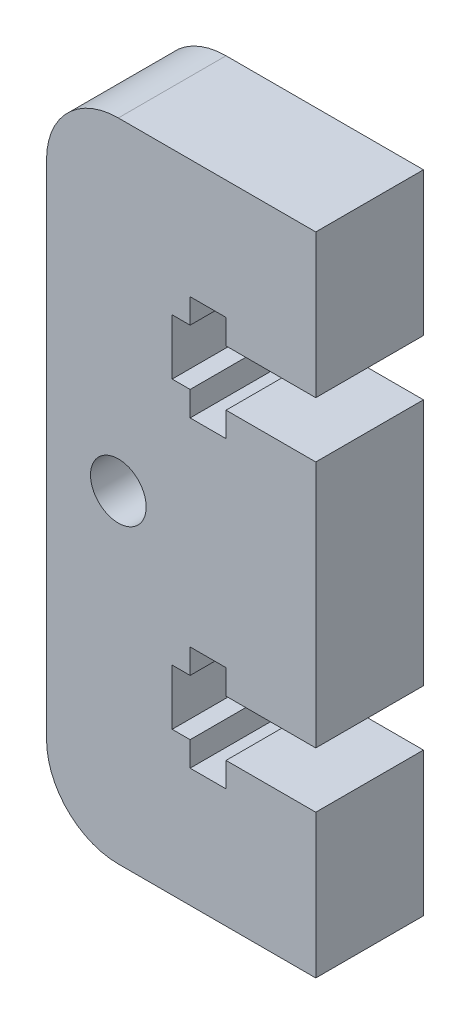
ISO-10303-21;
HEADER;
FILE_DESCRIPTION(('STEP AP214'),'2;1');
FILE_NAME('part.step','',(''),(''),'','','');
FILE_SCHEMA(('AUTOMOTIVE_DESIGN { 1 0 10303 214 1 1 1 1 }'));
ENDSEC;
DATA;
#1=APPLICATION_CONTEXT('core data for automotive mechanical design processes');
#2=APPLICATION_PROTOCOL_DEFINITION('international standard','automotive_design',2000,#1);
#3=PRODUCT_CONTEXT('',#1,'mechanical');
#4=PRODUCT('Part','Part','',(#3));
#5=PRODUCT_RELATED_PRODUCT_CATEGORY('part','',(#4));
#6=PRODUCT_DEFINITION_FORMATION('','',#4);
#7=PRODUCT_DEFINITION_CONTEXT('part definition',#1,'design');
#8=PRODUCT_DEFINITION('design','',#6,#7);
#9=PRODUCT_DEFINITION_SHAPE('','',#8);
#10=(LENGTH_UNIT() NAMED_UNIT(*) SI_UNIT(.MILLI.,.METRE.));
#11=(NAMED_UNIT(*) PLANE_ANGLE_UNIT() SI_UNIT($,.RADIAN.));
#12=(NAMED_UNIT(*) SI_UNIT($,.STERADIAN.) SOLID_ANGLE_UNIT());
#13=UNCERTAINTY_MEASURE_WITH_UNIT(LENGTH_MEASURE(1.E-05),#10,'distance_accuracy_value','');
#14=(GEOMETRIC_REPRESENTATION_CONTEXT(3) GLOBAL_UNCERTAINTY_ASSIGNED_CONTEXT((#13)) GLOBAL_UNIT_ASSIGNED_CONTEXT((#10,
#11,#12)) REPRESENTATION_CONTEXT('',''));
#15=CARTESIAN_POINT('',(0.,0.,0.));
#16=DIRECTION('',(0.,0.,1.));
#17=DIRECTION('',(1.,0.,0.));
#18=AXIS2_PLACEMENT_3D('',#15,#16,#17);
#19=CARTESIAN_POINT('',(1184.54189472516,236.727796113171,-5.99999999999998));
#20=DIRECTION('',(-1.,0.,0.));
#21=DIRECTION('',(0.,0.,1.));
#22=AXIS2_PLACEMENT_3D('',#19,#20,#21);
#23=PLANE('',#22);
#24=DIRECTION('',(0.,0.,-1.));
#25=VECTOR('',#24,1.);
#26=CARTESIAN_POINT('',(1184.54189472516,211.827796113171,9.00000000000016));
#27=LINE('',#26,#25);
#28=CARTESIAN_POINT('',(1184.54189472516,211.827796113171,0.));
#29=VERTEX_POINT('',#28);
#30=CARTESIAN_POINT('',(1184.54189472516,211.827796113171,-5.99999999999984));
#31=VERTEX_POINT('',#30);
#32=EDGE_CURVE('E286',#29,#31,#27,.T.);
#33=ORIENTED_EDGE('',*,*,#32,.T.);
#34=DIRECTION('',(0.,-1.,0.));
#35=VECTOR('',#34,1.);
#36=CARTESIAN_POINT('',(1184.54189472516,236.727796113171,-5.99999999999998));
#37=LINE('',#36,#35);
#38=CARTESIAN_POINT('',(1184.54189472516,225.627796113171,-5.99999999999984));
#39=VERTEX_POINT('',#38);
#40=EDGE_CURVE('E255',#39,#31,#37,.T.);
#41=ORIENTED_EDGE('',*,*,#40,.F.);
#42=DIRECTION('',(0.,0.,-1.));
#43=VECTOR('',#42,1.);
#44=CARTESIAN_POINT('',(1184.54189472516,225.627796113171,9.00000000000016));
#45=LINE('',#44,#43);
#46=CARTESIAN_POINT('',(1184.54189472516,225.627796113171,0.));
#47=VERTEX_POINT('',#46);
#48=EDGE_CURVE('E340',#47,#39,#45,.T.);
#49=ORIENTED_EDGE('',*,*,#48,.F.);
#50=DIRECTION('',(0.,-1.,0.));
#51=VECTOR('',#50,1.);
#52=CARTESIAN_POINT('',(1184.54189472516,236.727796113171,0.));
#53=LINE('',#52,#51);
#54=EDGE_CURVE('E391',#47,#29,#53,.T.);
#55=ORIENTED_EDGE('',*,*,#54,.T.);
#56=EDGE_LOOP('',(#33,#41,#49,#55));
#57=FACE_BOUND('',#56,.T.);
#58=ADVANCED_FACE('F34',(#57),#23,.F.);
#59=DIRECTION('',(0.,0.,-1.));
#60=VECTOR('',#59,1.);
#61=CARTESIAN_POINT('',(1184.54189472516,208.727796113171,9.00000000000016));
#62=LINE('',#61,#60);
#63=CARTESIAN_POINT('',(1184.54189472516,208.727796113171,0.));
#64=VERTEX_POINT('',#63);
#65=CARTESIAN_POINT('',(1184.54189472516,208.727796113171,-5.99999999999984));
#66=VERTEX_POINT('',#65);
#67=EDGE_CURVE('E288',#64,#66,#62,.T.);
#68=ORIENTED_EDGE('',*,*,#67,.F.);
#69=CARTESIAN_POINT('',(1184.54189472516,200.727796113171,0.));
#70=VERTEX_POINT('',#69);
#71=EDGE_CURVE('E387',#64,#70,#53,.T.);
#72=ORIENTED_EDGE('',*,*,#71,.T.);
#73=DIRECTION('',(0.,0.,1.));
#74=VECTOR('',#73,1.);
#75=CARTESIAN_POINT('',(1184.54189472516,200.727796113171,-5.99999999999998));
#76=LINE('',#75,#74);
#77=CARTESIAN_POINT('',(1184.54189472516,200.727796113171,-5.99999999999998));
#78=VERTEX_POINT('',#77);
#79=EDGE_CURVE('E395',#78,#70,#76,.T.);
#80=ORIENTED_EDGE('',*,*,#79,.F.);
#81=EDGE_CURVE('E372',#66,#78,#37,.T.);
#82=ORIENTED_EDGE('',*,*,#81,.F.);
#83=EDGE_LOOP('',(#68,#72,#80,#82));
#84=FACE_BOUND('',#83,.T.);
#85=ADVANCED_FACE('F496',(#84),#23,.F.);
#86=CARTESIAN_POINT('',(1173.54189472516,204.727796113171,-5.99999999999998));
#87=DIRECTION('',(0.,0.,-1.));
#88=DIRECTION('',(-1.,0.,0.));
#89=AXIS2_PLACEMENT_3D('',#86,#87,#88);
#90=PLANE('',#89);
#91=CARTESIAN_POINT('',(1173.54189472516,218.727796113171,-5.99999999999998));
#92=DIRECTION('',(0.,0.,-1.));
#93=DIRECTION('',(-1.,0.,0.));
#94=AXIS2_PLACEMENT_3D('',#91,#92,#93);
#95=CIRCLE('',#94,1.54999999999999);
#96=CARTESIAN_POINT('',(1171.99189472516,218.727796113171,-5.99999999999998));
#97=VERTEX_POINT('',#96);
#98=EDGE_CURVE('E258',#97,#97,#95,.T.);
#99=ORIENTED_EDGE('',*,*,#98,.F.);
#100=EDGE_LOOP('',(#99));
#101=FACE_BOUND('',#100,.T.);
#102=ORIENTED_EDGE('',*,*,#40,.T.);
#103=DIRECTION('',(-1.,0.,0.));
#104=VECTOR('',#103,1.);
#105=CARTESIAN_POINT('',(1184.54189472516,211.827796113171,-5.99999999999984));
#106=LINE('',#105,#104);
#107=CARTESIAN_POINT('',(1179.54189472516,211.827796113171,-5.99999999999984));
#108=VERTEX_POINT('',#107);
#109=EDGE_CURVE('E234',#31,#108,#106,.T.);
#110=ORIENTED_EDGE('',*,*,#109,.T.);
#111=DIRECTION('',(0.,1.,0.));
#112=VECTOR('',#111,1.);
#113=CARTESIAN_POINT('',(1179.54189472516,213.202796113171,-5.99999999999984));
#114=LINE('',#113,#112);
#115=CARTESIAN_POINT('',(1179.54189472516,213.202796113171,-5.99999999999984));
#116=VERTEX_POINT('',#115);
#117=EDGE_CURVE('E243',#108,#116,#114,.T.);
#118=ORIENTED_EDGE('',*,*,#117,.T.);
#119=DIRECTION('',(-1.,0.,0.));
#120=VECTOR('',#119,1.);
#121=CARTESIAN_POINT('',(1177.54189472516,213.202796113171,-5.99999999999984));
#122=LINE('',#121,#120);
#123=CARTESIAN_POINT('',(1177.54189472516,213.202796113171,-5.99999999999984));
#124=VERTEX_POINT('',#123);
#125=EDGE_CURVE('E249',#116,#124,#122,.T.);
#126=ORIENTED_EDGE('',*,*,#125,.T.);
#127=DIRECTION('',(0.,-1.,0.));
#128=VECTOR('',#127,1.);
#129=CARTESIAN_POINT('',(1177.54189472516,213.202796113171,-5.99999999999984));
#130=LINE('',#129,#128);
#131=CARTESIAN_POINT('',(1177.54189472516,211.827796113171,-5.99999999999984));
#132=VERTEX_POINT('',#131);
#133=EDGE_CURVE('E262',#124,#132,#130,.T.);
#134=ORIENTED_EDGE('',*,*,#133,.T.);
#135=DIRECTION('',(-1.,0.,0.));
#136=VECTOR('',#135,1.);
#137=CARTESIAN_POINT('',(1177.54189472516,211.827796113171,-5.99999999999984));
#138=LINE('',#137,#136);
#139=CARTESIAN_POINT('',(1176.54189472516,211.827796113171,-5.99999999999984));
#140=VERTEX_POINT('',#139);
#141=EDGE_CURVE('E265',#132,#140,#138,.T.);
#142=ORIENTED_EDGE('',*,*,#141,.T.);
#143=DIRECTION('',(0.,-1.,0.));
#144=VECTOR('',#143,1.);
#145=CARTESIAN_POINT('',(1176.54189472516,211.827796113171,-5.99999999999984));
#146=LINE('',#145,#144);
#147=CARTESIAN_POINT('',(1176.54189472516,208.727796113171,-5.99999999999984));
#148=VERTEX_POINT('',#147);
#149=EDGE_CURVE('E268',#140,#148,#146,.T.);
#150=ORIENTED_EDGE('',*,*,#149,.T.);
#151=DIRECTION('',(1.,0.,0.));
#152=VECTOR('',#151,1.);
#153=CARTESIAN_POINT('',(1177.54189472516,208.727796113171,-5.99999999999984));
#154=LINE('',#153,#152);
#155=CARTESIAN_POINT('',(1177.54189472516,208.727796113171,-5.99999999999984));
#156=VERTEX_POINT('',#155);
#157=EDGE_CURVE('E271',#148,#156,#154,.T.);
#158=ORIENTED_EDGE('',*,*,#157,.T.);
#159=DIRECTION('',(0.,-1.,0.));
#160=VECTOR('',#159,1.);
#161=CARTESIAN_POINT('',(1177.54189472516,208.727796113171,-5.99999999999984));
#162=LINE('',#161,#160);
#163=CARTESIAN_POINT('',(1177.54189472516,207.352796113171,-5.99999999999984));
#164=VERTEX_POINT('',#163);
#165=EDGE_CURVE('E274',#156,#164,#162,.T.);
#166=ORIENTED_EDGE('',*,*,#165,.T.);
#167=DIRECTION('',(1.,0.,0.));
#168=VECTOR('',#167,1.);
#169=CARTESIAN_POINT('',(1177.54189472516,207.352796113171,-5.99999999999984));
#170=LINE('',#169,#168);
#171=CARTESIAN_POINT('',(1179.54189472516,207.352796113171,-5.99999999999984));
#172=VERTEX_POINT('',#171);
#173=EDGE_CURVE('E277',#164,#172,#170,.T.);
#174=ORIENTED_EDGE('',*,*,#173,.T.);
#175=DIRECTION('',(0.,1.,0.));
#176=VECTOR('',#175,1.);
#177=CARTESIAN_POINT('',(1179.54189472516,208.727796113171,-5.99999999999984));
#178=LINE('',#177,#176);
#179=CARTESIAN_POINT('',(1179.54189472516,208.727796113171,-5.99999999999984));
#180=VERTEX_POINT('',#179);
#181=EDGE_CURVE('E280',#172,#180,#178,.T.);
#182=ORIENTED_EDGE('',*,*,#181,.T.);
#183=DIRECTION('',(1.,0.,0.));
#184=VECTOR('',#183,1.);
#185=CARTESIAN_POINT('',(1184.54189472516,208.727796113171,-5.99999999999984));
#186=LINE('',#185,#184);
#187=EDGE_CURVE('E283',#180,#66,#186,.T.);
#188=ORIENTED_EDGE('',*,*,#187,.T.);
#189=ORIENTED_EDGE('',*,*,#81,.T.);
#190=DIRECTION('',(-1.,0.,0.));
#191=VECTOR('',#190,1.);
#192=CARTESIAN_POINT('',(1184.54189472516,200.727796113171,-5.99999999999998));
#193=LINE('',#192,#191);
#194=CARTESIAN_POINT('',(1173.54189472516,200.727796113171,-5.99999999999998));
#195=VERTEX_POINT('',#194);
#196=EDGE_CURVE('E376',#78,#195,#193,.T.);
#197=ORIENTED_EDGE('',*,*,#196,.T.);
#198=CARTESIAN_POINT('',(1173.54189472516,204.727796113171,-5.99999999999998));
#199=DIRECTION('',(0.,0.,-1.));
#200=DIRECTION('',(-1.,0.,0.));
#201=AXIS2_PLACEMENT_3D('',#198,#199,#200);
#202=CIRCLE('',#201,4.);
#203=CARTESIAN_POINT('',(1169.54189472516,204.727796113171,-5.99999999999998));
#204=VERTEX_POINT('',#203);
#205=EDGE_CURVE('E362',#195,#204,#202,.T.);
#206=ORIENTED_EDGE('',*,*,#205,.T.);
#207=DIRECTION('',(0.,1.,0.));
#208=VECTOR('',#207,1.);
#209=CARTESIAN_POINT('',(1169.54189472516,232.727796113171,-5.99999999999998));
#210=LINE('',#209,#208);
#211=CARTESIAN_POINT('',(1169.54189472516,232.727796113171,-5.99999999999998));
#212=VERTEX_POINT('',#211);
#213=EDGE_CURVE('E365',#204,#212,#210,.T.);
#214=ORIENTED_EDGE('',*,*,#213,.T.);
#215=CARTESIAN_POINT('',(1173.54189472516,232.727796113171,-5.99999999999998));
#216=DIRECTION('',(0.,0.,-1.));
#217=DIRECTION('',(1.,0.,0.));
#218=AXIS2_PLACEMENT_3D('',#215,#216,#217);
#219=CIRCLE('',#218,4.);
#220=CARTESIAN_POINT('',(1173.54189472516,236.727796113171,-5.99999999999998));
#221=VERTEX_POINT('',#220);
#222=EDGE_CURVE('E368',#212,#221,#219,.T.);
#223=ORIENTED_EDGE('',*,*,#222,.T.);
#224=DIRECTION('',(1.,0.,0.));
#225=VECTOR('',#224,1.);
#226=CARTESIAN_POINT('',(1184.54189472516,236.727796113171,-5.99999999999998));
#227=LINE('',#226,#225);
#228=CARTESIAN_POINT('',(1184.54189472516,236.727796113171,-5.99999999999998));
#229=VERTEX_POINT('',#228);
#230=EDGE_CURVE('E370',#221,#229,#227,.T.);
#231=ORIENTED_EDGE('',*,*,#230,.T.);
#232=CARTESIAN_POINT('',(1184.54189472516,228.727796113171,-5.99999999999984));
#233=VERTEX_POINT('',#232);
#234=EDGE_CURVE('E373',#229,#233,#37,.T.);
#235=ORIENTED_EDGE('',*,*,#234,.T.);
#236=DIRECTION('',(-1.,0.,0.));
#237=VECTOR('',#236,1.);
#238=CARTESIAN_POINT('',(1184.54189472516,228.727796113171,-5.99999999999984));
#239=LINE('',#238,#237);
#240=CARTESIAN_POINT('',(1179.54189472516,228.727796113171,-5.99999999999984));
#241=VERTEX_POINT('',#240);
#242=EDGE_CURVE('E239',#233,#241,#239,.T.);
#243=ORIENTED_EDGE('',*,*,#242,.T.);
#244=DIRECTION('',(0.,1.,0.));
#245=VECTOR('',#244,1.);
#246=CARTESIAN_POINT('',(1179.54189472516,230.102796113171,-5.99999999999984));
#247=LINE('',#246,#245);
#248=CARTESIAN_POINT('',(1179.54189472516,230.102796113171,-5.99999999999984));
#249=VERTEX_POINT('',#248);
#250=EDGE_CURVE('E308',#241,#249,#247,.T.);
#251=ORIENTED_EDGE('',*,*,#250,.T.);
#252=DIRECTION('',(-1.,0.,0.));
#253=VECTOR('',#252,1.);
#254=CARTESIAN_POINT('',(1177.54189472516,230.102796113171,-5.99999999999984));
#255=LINE('',#254,#253);
#256=CARTESIAN_POINT('',(1177.54189472516,230.102796113171,-5.99999999999984));
#257=VERTEX_POINT('',#256);
#258=EDGE_CURVE('E311',#249,#257,#255,.T.);
#259=ORIENTED_EDGE('',*,*,#258,.T.);
#260=DIRECTION('',(0.,-1.,0.));
#261=VECTOR('',#260,1.);
#262=CARTESIAN_POINT('',(1177.54189472516,230.102796113171,-5.99999999999984));
#263=LINE('',#262,#261);
#264=CARTESIAN_POINT('',(1177.54189472516,228.727796113171,-5.99999999999984));
#265=VERTEX_POINT('',#264);
#266=EDGE_CURVE('E314',#257,#265,#263,.T.);
#267=ORIENTED_EDGE('',*,*,#266,.T.);
#268=DIRECTION('',(-1.,0.,0.));
#269=VECTOR('',#268,1.);
#270=CARTESIAN_POINT('',(1177.54189472516,228.727796113171,-5.99999999999984));
#271=LINE('',#270,#269);
#272=CARTESIAN_POINT('',(1176.54189472516,228.727796113171,-5.99999999999984));
#273=VERTEX_POINT('',#272);
#274=EDGE_CURVE('E317',#265,#273,#271,.T.);
#275=ORIENTED_EDGE('',*,*,#274,.T.);
#276=DIRECTION('',(0.,-1.,0.));
#277=VECTOR('',#276,1.);
#278=CARTESIAN_POINT('',(1176.54189472516,228.727796113171,-5.99999999999984));
#279=LINE('',#278,#277);
#280=CARTESIAN_POINT('',(1176.54189472516,225.627796113171,-5.99999999999984));
#281=VERTEX_POINT('',#280);
#282=EDGE_CURVE('E320',#273,#281,#279,.T.);
#283=ORIENTED_EDGE('',*,*,#282,.T.);
#284=DIRECTION('',(1.,0.,0.));
#285=VECTOR('',#284,1.);
#286=CARTESIAN_POINT('',(1177.54189472516,225.627796113171,-5.99999999999984));
#287=LINE('',#286,#285);
#288=CARTESIAN_POINT('',(1177.54189472516,225.627796113171,-5.99999999999984));
#289=VERTEX_POINT('',#288);
#290=EDGE_CURVE('E323',#281,#289,#287,.T.);
#291=ORIENTED_EDGE('',*,*,#290,.T.);
#292=DIRECTION('',(0.,-1.,0.));
#293=VECTOR('',#292,1.);
#294=CARTESIAN_POINT('',(1177.54189472516,225.627796113171,-5.99999999999984));
#295=LINE('',#294,#293);
#296=CARTESIAN_POINT('',(1177.54189472516,224.252796113171,-5.99999999999984));
#297=VERTEX_POINT('',#296);
#298=EDGE_CURVE('E326',#289,#297,#295,.T.);
#299=ORIENTED_EDGE('',*,*,#298,.T.);
#300=DIRECTION('',(1.,0.,0.));
#301=VECTOR('',#300,1.);
#302=CARTESIAN_POINT('',(1177.54189472516,224.252796113171,-5.99999999999984));
#303=LINE('',#302,#301);
#304=CARTESIAN_POINT('',(1179.54189472516,224.252796113171,-5.99999999999984));
#305=VERTEX_POINT('',#304);
#306=EDGE_CURVE('E329',#297,#305,#303,.T.);
#307=ORIENTED_EDGE('',*,*,#306,.T.);
#308=DIRECTION('',(0.,1.,0.));
#309=VECTOR('',#308,1.);
#310=CARTESIAN_POINT('',(1179.54189472516,225.627796113171,-5.99999999999984));
#311=LINE('',#310,#309);
#312=CARTESIAN_POINT('',(1179.54189472516,225.627796113171,-5.99999999999984));
#313=VERTEX_POINT('',#312);
#314=EDGE_CURVE('E332',#305,#313,#311,.T.);
#315=ORIENTED_EDGE('',*,*,#314,.T.);
#316=DIRECTION('',(1.,0.,0.));
#317=VECTOR('',#316,1.);
#318=CARTESIAN_POINT('',(1184.54189472516,225.627796113171,-5.99999999999984));
#319=LINE('',#318,#317);
#320=EDGE_CURVE('E335',#313,#39,#319,.T.);
#321=ORIENTED_EDGE('',*,*,#320,.T.);
#322=EDGE_LOOP('',(#102,#110,#118,#126,#134,#142,#150,#158,#166,#174,#182,#188,#189,#197,#206,
#214,#223,#231,#235,#243,#251,#259,#267,#275,#283,#291,#299,#307,#315,#321));
#323=FACE_BOUND('',#322,.T.);
#324=ADVANCED_FACE('F252',(#101,#323),#90,.T.);
#325=CARTESIAN_POINT('',(1173.54189472516,204.727796113171,0.));
#326=DIRECTION('',(0.,0.,-1.));
#327=DIRECTION('',(-1.,0.,0.));
#328=AXIS2_PLACEMENT_3D('',#325,#326,#327);
#329=PLANE('',#328);
#330=CARTESIAN_POINT('',(1173.54189472516,218.727796113171,0.));
#331=DIRECTION('',(0.,0.,-1.));
#332=DIRECTION('',(-1.,0.,0.));
#333=AXIS2_PLACEMENT_3D('',#330,#331,#332);
#334=CIRCLE('',#333,1.54999999999999);
#335=CARTESIAN_POINT('',(1171.99189472516,218.727796113171,0.));
#336=VERTEX_POINT('',#335);
#337=EDGE_CURVE('E38',#336,#336,#334,.T.);
#338=ORIENTED_EDGE('',*,*,#337,.T.);
#339=EDGE_LOOP('',(#338));
#340=FACE_BOUND('',#339,.T.);
#341=DIRECTION('',(-1.,0.,0.));
#342=VECTOR('',#341,1.);
#343=CARTESIAN_POINT('',(1173.54189472516,211.827796113171,0.));
#344=LINE('',#343,#342);
#345=CARTESIAN_POINT('',(1179.54189472516,211.827796113171,0.));
#346=VERTEX_POINT('',#345);
#347=EDGE_CURVE('E11',#29,#346,#344,.T.);
#348=ORIENTED_EDGE('',*,*,#347,.F.);
#349=ORIENTED_EDGE('',*,*,#54,.F.);
#350=DIRECTION('',(1.,0.,0.));
#351=VECTOR('',#350,1.);
#352=CARTESIAN_POINT('',(1173.54189472516,225.627796113171,0.));
#353=LINE('',#352,#351);
#354=CARTESIAN_POINT('',(1179.54189472516,225.627796113171,0.));
#355=VERTEX_POINT('',#354);
#356=EDGE_CURVE('E410',#355,#47,#353,.T.);
#357=ORIENTED_EDGE('',*,*,#356,.F.);
#358=DIRECTION('',(0.,1.,0.));
#359=VECTOR('',#358,1.);
#360=CARTESIAN_POINT('',(1179.54189472516,204.727796113171,0.));
#361=LINE('',#360,#359);
#362=CARTESIAN_POINT('',(1179.54189472516,224.252796113171,0.));
#363=VERTEX_POINT('',#362);
#364=EDGE_CURVE('E412',#363,#355,#361,.T.);
#365=ORIENTED_EDGE('',*,*,#364,.F.);
#366=DIRECTION('',(1.,0.,0.));
#367=VECTOR('',#366,1.);
#368=CARTESIAN_POINT('',(1173.54189472516,224.252796113171,0.));
#369=LINE('',#368,#367);
#370=CARTESIAN_POINT('',(1177.54189472516,224.252796113171,0.));
#371=VERTEX_POINT('',#370);
#372=EDGE_CURVE('E414',#371,#363,#369,.T.);
#373=ORIENTED_EDGE('',*,*,#372,.F.);
#374=DIRECTION('',(0.,-1.,0.));
#375=VECTOR('',#374,1.);
#376=CARTESIAN_POINT('',(1177.54189472516,204.727796113171,0.));
#377=LINE('',#376,#375);
#378=CARTESIAN_POINT('',(1177.54189472516,225.627796113171,0.));
#379=VERTEX_POINT('',#378);
#380=EDGE_CURVE('E416',#379,#371,#377,.T.);
#381=ORIENTED_EDGE('',*,*,#380,.F.);
#382=DIRECTION('',(1.,0.,0.));
#383=VECTOR('',#382,1.);
#384=CARTESIAN_POINT('',(1173.54189472516,225.627796113171,0.));
#385=LINE('',#384,#383);
#386=CARTESIAN_POINT('',(1176.54189472516,225.627796113171,0.));
#387=VERTEX_POINT('',#386);
#388=EDGE_CURVE('E418',#387,#379,#385,.T.);
#389=ORIENTED_EDGE('',*,*,#388,.F.);
#390=DIRECTION('',(0.,-1.,0.));
#391=VECTOR('',#390,1.);
#392=CARTESIAN_POINT('',(1176.54189472516,204.727796113171,0.));
#393=LINE('',#392,#391);
#394=CARTESIAN_POINT('',(1176.54189472516,228.727796113171,0.));
#395=VERTEX_POINT('',#394);
#396=EDGE_CURVE('E420',#395,#387,#393,.T.);
#397=ORIENTED_EDGE('',*,*,#396,.F.);
#398=DIRECTION('',(-1.,0.,0.));
#399=VECTOR('',#398,1.);
#400=CARTESIAN_POINT('',(1173.54189472516,228.727796113171,0.));
#401=LINE('',#400,#399);
#402=CARTESIAN_POINT('',(1177.54189472516,228.727796113171,0.));
#403=VERTEX_POINT('',#402);
#404=EDGE_CURVE('E422',#403,#395,#401,.T.);
#405=ORIENTED_EDGE('',*,*,#404,.F.);
#406=DIRECTION('',(0.,-1.,0.));
#407=VECTOR('',#406,1.);
#408=CARTESIAN_POINT('',(1177.54189472516,204.727796113171,0.));
#409=LINE('',#408,#407);
#410=CARTESIAN_POINT('',(1177.54189472516,230.102796113171,0.));
#411=VERTEX_POINT('',#410);
#412=EDGE_CURVE('E424',#411,#403,#409,.T.);
#413=ORIENTED_EDGE('',*,*,#412,.F.);
#414=DIRECTION('',(-1.,0.,0.));
#415=VECTOR('',#414,1.);
#416=CARTESIAN_POINT('',(1173.54189472516,230.102796113171,0.));
#417=LINE('',#416,#415);
#418=CARTESIAN_POINT('',(1179.54189472516,230.102796113171,0.));
#419=VERTEX_POINT('',#418);
#420=EDGE_CURVE('E426',#419,#411,#417,.T.);
#421=ORIENTED_EDGE('',*,*,#420,.F.);
#422=DIRECTION('',(0.,1.,0.));
#423=VECTOR('',#422,1.);
#424=CARTESIAN_POINT('',(1179.54189472516,204.727796113171,0.));
#425=LINE('',#424,#423);
#426=CARTESIAN_POINT('',(1179.54189472516,228.727796113171,0.));
#427=VERTEX_POINT('',#426);
#428=EDGE_CURVE('E428',#427,#419,#425,.T.);
#429=ORIENTED_EDGE('',*,*,#428,.F.);
#430=DIRECTION('',(-1.,0.,0.));
#431=VECTOR('',#430,1.);
#432=CARTESIAN_POINT('',(1173.54189472516,228.727796113171,0.));
#433=LINE('',#432,#431);
#434=CARTESIAN_POINT('',(1184.54189472516,228.727796113171,0.));
#435=VERTEX_POINT('',#434);
#436=EDGE_CURVE('E430',#435,#427,#433,.T.);
#437=ORIENTED_EDGE('',*,*,#436,.F.);
#438=CARTESIAN_POINT('',(1184.54189472516,236.727796113171,0.));
#439=VERTEX_POINT('',#438);
#440=EDGE_CURVE('E388',#439,#435,#53,.T.);
#441=ORIENTED_EDGE('',*,*,#440,.F.);
#442=DIRECTION('',(1.,0.,0.));
#443=VECTOR('',#442,1.);
#444=CARTESIAN_POINT('',(1184.54189472516,236.727796113171,0.));
#445=LINE('',#444,#443);
#446=CARTESIAN_POINT('',(1173.54189472516,236.727796113171,0.));
#447=VERTEX_POINT('',#446);
#448=EDGE_CURVE('E385',#447,#439,#445,.T.);
#449=ORIENTED_EDGE('',*,*,#448,.F.);
#450=CARTESIAN_POINT('',(1173.54189472516,232.727796113171,0.));
#451=DIRECTION('',(0.,0.,-1.));
#452=DIRECTION('',(1.,0.,0.));
#453=AXIS2_PLACEMENT_3D('',#450,#451,#452);
#454=CIRCLE('',#453,4.);
#455=CARTESIAN_POINT('',(1169.54189472516,232.727796113171,0.));
#456=VERTEX_POINT('',#455);
#457=EDGE_CURVE('E383',#456,#447,#454,.T.);
#458=ORIENTED_EDGE('',*,*,#457,.F.);
#459=DIRECTION('',(0.,1.,0.));
#460=VECTOR('',#459,1.);
#461=CARTESIAN_POINT('',(1169.54189472516,232.727796113171,0.));
#462=LINE('',#461,#460);
#463=CARTESIAN_POINT('',(1169.54189472516,204.727796113171,0.));
#464=VERTEX_POINT('',#463);
#465=EDGE_CURVE('E381',#464,#456,#462,.T.);
#466=ORIENTED_EDGE('',*,*,#465,.F.);
#467=CARTESIAN_POINT('',(1173.54189472516,204.727796113171,0.));
#468=DIRECTION('',(0.,0.,-1.));
#469=DIRECTION('',(-1.,0.,0.));
#470=AXIS2_PLACEMENT_3D('',#467,#468,#469);
#471=CIRCLE('',#470,4.);
#472=CARTESIAN_POINT('',(1173.54189472516,200.727796113171,0.));
#473=VERTEX_POINT('',#472);
#474=EDGE_CURVE('E361',#473,#464,#471,.T.);
#475=ORIENTED_EDGE('',*,*,#474,.F.);
#476=DIRECTION('',(-1.,0.,0.));
#477=VECTOR('',#476,1.);
#478=CARTESIAN_POINT('',(1184.54189472516,200.727796113171,0.));
#479=LINE('',#478,#477);
#480=EDGE_CURVE('E366',#70,#473,#479,.T.);
#481=ORIENTED_EDGE('',*,*,#480,.F.);
#482=ORIENTED_EDGE('',*,*,#71,.F.);
#483=DIRECTION('',(1.,0.,0.));
#484=VECTOR('',#483,1.);
#485=CARTESIAN_POINT('',(1173.54189472516,208.727796113171,0.));
#486=LINE('',#485,#484);
#487=CARTESIAN_POINT('',(1179.54189472516,208.727796113171,0.));
#488=VERTEX_POINT('',#487);
#489=EDGE_CURVE('E432',#488,#64,#486,.T.);
#490=ORIENTED_EDGE('',*,*,#489,.F.);
#491=DIRECTION('',(0.,1.,0.));
#492=VECTOR('',#491,1.);
#493=CARTESIAN_POINT('',(1179.54189472516,204.727796113171,0.));
#494=LINE('',#493,#492);
#495=CARTESIAN_POINT('',(1179.54189472516,207.352796113171,0.));
#496=VERTEX_POINT('',#495);
#497=EDGE_CURVE('E434',#496,#488,#494,.T.);
#498=ORIENTED_EDGE('',*,*,#497,.F.);
#499=DIRECTION('',(1.,0.,0.));
#500=VECTOR('',#499,1.);
#501=CARTESIAN_POINT('',(1173.54189472516,207.352796113171,0.));
#502=LINE('',#501,#500);
#503=CARTESIAN_POINT('',(1177.54189472516,207.352796113171,0.));
#504=VERTEX_POINT('',#503);
#505=EDGE_CURVE('E436',#504,#496,#502,.T.);
#506=ORIENTED_EDGE('',*,*,#505,.F.);
#507=DIRECTION('',(0.,-1.,0.));
#508=VECTOR('',#507,1.);
#509=CARTESIAN_POINT('',(1177.54189472516,204.727796113171,0.));
#510=LINE('',#509,#508);
#511=CARTESIAN_POINT('',(1177.54189472516,208.727796113171,0.));
#512=VERTEX_POINT('',#511);
#513=EDGE_CURVE('E438',#512,#504,#510,.T.);
#514=ORIENTED_EDGE('',*,*,#513,.F.);
#515=DIRECTION('',(1.,0.,0.));
#516=VECTOR('',#515,1.);
#517=CARTESIAN_POINT('',(1173.54189472516,208.727796113171,0.));
#518=LINE('',#517,#516);
#519=CARTESIAN_POINT('',(1176.54189472516,208.727796113171,0.));
#520=VERTEX_POINT('',#519);
#521=EDGE_CURVE('E440',#520,#512,#518,.T.);
#522=ORIENTED_EDGE('',*,*,#521,.F.);
#523=DIRECTION('',(0.,-1.,0.));
#524=VECTOR('',#523,1.);
#525=CARTESIAN_POINT('',(1176.54189472516,204.727796113171,0.));
#526=LINE('',#525,#524);
#527=CARTESIAN_POINT('',(1176.54189472516,211.827796113171,0.));
#528=VERTEX_POINT('',#527);
#529=EDGE_CURVE('E442',#528,#520,#526,.T.);
#530=ORIENTED_EDGE('',*,*,#529,.F.);
#531=DIRECTION('',(-1.,0.,0.));
#532=VECTOR('',#531,1.);
#533=CARTESIAN_POINT('',(1173.54189472516,211.827796113171,0.));
#534=LINE('',#533,#532);
#535=CARTESIAN_POINT('',(1177.54189472516,211.827796113171,0.));
#536=VERTEX_POINT('',#535);
#537=EDGE_CURVE('E444',#536,#528,#534,.T.);
#538=ORIENTED_EDGE('',*,*,#537,.F.);
#539=DIRECTION('',(0.,-1.,0.));
#540=VECTOR('',#539,1.);
#541=CARTESIAN_POINT('',(1177.54189472516,204.727796113171,0.));
#542=LINE('',#541,#540);
#543=CARTESIAN_POINT('',(1177.54189472516,213.202796113171,0.));
#544=VERTEX_POINT('',#543);
#545=EDGE_CURVE('E446',#544,#536,#542,.T.);
#546=ORIENTED_EDGE('',*,*,#545,.F.);
#547=DIRECTION('',(-1.,0.,0.));
#548=VECTOR('',#547,1.);
#549=CARTESIAN_POINT('',(1173.54189472516,213.202796113171,0.));
#550=LINE('',#549,#548);
#551=CARTESIAN_POINT('',(1179.54189472516,213.202796113171,0.));
#552=VERTEX_POINT('',#551);
#553=EDGE_CURVE('E448',#552,#544,#550,.T.);
#554=ORIENTED_EDGE('',*,*,#553,.F.);
#555=DIRECTION('',(0.,1.,0.));
#556=VECTOR('',#555,1.);
#557=CARTESIAN_POINT('',(1179.54189472516,204.727796113171,0.));
#558=LINE('',#557,#556);
#559=EDGE_CURVE('E43',#346,#552,#558,.T.);
#560=ORIENTED_EDGE('',*,*,#559,.F.);
#561=EDGE_LOOP('',(#348,#349,#357,#365,#373,#381,#389,#397,#405,#413,#421,#429,#437,#441,#449,
#458,#466,#475,#481,#482,#490,#498,#506,#514,#522,#530,#538,#546,#554,#560));
#562=FACE_BOUND('',#561,.T.);
#563=ADVANCED_FACE('F456',(#340,#562),#329,.F.);
#564=DIRECTION('',(0.,0.,-1.));
#565=VECTOR('',#564,1.);
#566=CARTESIAN_POINT('',(1184.54189472516,228.727796113171,9.00000000000016));
#567=LINE('',#566,#565);
#568=EDGE_CURVE('E337',#435,#233,#567,.T.);
#569=ORIENTED_EDGE('',*,*,#568,.T.);
#570=ORIENTED_EDGE('',*,*,#234,.F.);
#571=DIRECTION('',(0.,0.,1.));
#572=VECTOR('',#571,1.);
#573=CARTESIAN_POINT('',(1184.54189472516,236.727796113171,-5.99999999999998));
#574=LINE('',#573,#572);
#575=EDGE_CURVE('E398',#229,#439,#574,.T.);
#576=ORIENTED_EDGE('',*,*,#575,.T.);
#577=ORIENTED_EDGE('',*,*,#440,.T.);
#578=EDGE_LOOP('',(#569,#570,#576,#577));
#579=FACE_BOUND('',#578,.T.);
#580=ADVANCED_FACE('F523',(#579),#23,.F.);
#581=CARTESIAN_POINT('',(1173.54189472516,204.727796113171,-5.99999999999998));
#582=DIRECTION('',(0.,0.,1.));
#583=DIRECTION('',(1.,0.,0.));
#584=AXIS2_PLACEMENT_3D('',#581,#582,#583);
#585=CYLINDRICAL_SURFACE('',#584,4.);
#586=ORIENTED_EDGE('',*,*,#474,.T.);
#587=DIRECTION('',(0.,0.,1.));
#588=VECTOR('',#587,1.);
#589=CARTESIAN_POINT('',(1169.54189472516,204.727796113171,-5.99999999999998));
#590=LINE('',#589,#588);
#591=EDGE_CURVE('E407',#204,#464,#590,.T.);
#592=ORIENTED_EDGE('',*,*,#591,.F.);
#593=ORIENTED_EDGE('',*,*,#205,.F.);
#594=DIRECTION('',(0.,0.,1.));
#595=VECTOR('',#594,1.);
#596=CARTESIAN_POINT('',(1173.54189472516,200.727796113171,-5.99999999999998));
#597=LINE('',#596,#595);
#598=EDGE_CURVE('E378',#195,#473,#597,.T.);
#599=ORIENTED_EDGE('',*,*,#598,.T.);
#600=EDGE_LOOP('',(#586,#592,#593,#599));
#601=FACE_BOUND('',#600,.T.);
#602=ADVANCED_FACE('F36',(#601),#585,.T.);
#603=CARTESIAN_POINT('',(1169.54189472516,232.727796113171,-5.99999999999998));
#604=DIRECTION('',(1.,0.,0.));
#605=DIRECTION('',(0.,0.,-1.));
#606=AXIS2_PLACEMENT_3D('',#603,#604,#605);
#607=PLANE('',#606);
#608=ORIENTED_EDGE('',*,*,#465,.T.);
#609=DIRECTION('',(0.,0.,1.));
#610=VECTOR('',#609,1.);
#611=CARTESIAN_POINT('',(1169.54189472516,232.727796113171,-5.99999999999998));
#612=LINE('',#611,#610);
#613=EDGE_CURVE('E404',#212,#456,#612,.T.);
#614=ORIENTED_EDGE('',*,*,#613,.F.);
#615=ORIENTED_EDGE('',*,*,#213,.F.);
#616=ORIENTED_EDGE('',*,*,#591,.T.);
#617=EDGE_LOOP('',(#608,#614,#615,#616));
#618=FACE_BOUND('',#617,.T.);
#619=ADVANCED_FACE('F509',(#618),#607,.F.);
#620=CARTESIAN_POINT('',(1173.54189472516,232.727796113171,-5.99999999999998));
#621=DIRECTION('',(0.,0.,1.));
#622=DIRECTION('',(1.,0.,0.));
#623=AXIS2_PLACEMENT_3D('',#620,#621,#622);
#624=CYLINDRICAL_SURFACE('',#623,4.);
#625=ORIENTED_EDGE('',*,*,#457,.T.);
#626=DIRECTION('',(0.,0.,1.));
#627=VECTOR('',#626,1.);
#628=CARTESIAN_POINT('',(1173.54189472516,236.727796113171,-5.99999999999998));
#629=LINE('',#628,#627);
#630=EDGE_CURVE('E401',#221,#447,#629,.T.);
#631=ORIENTED_EDGE('',*,*,#630,.F.);
#632=ORIENTED_EDGE('',*,*,#222,.F.);
#633=ORIENTED_EDGE('',*,*,#613,.T.);
#634=EDGE_LOOP('',(#625,#631,#632,#633));
#635=FACE_BOUND('',#634,.T.);
#636=ADVANCED_FACE('F514',(#635),#624,.T.);
#637=CARTESIAN_POINT('',(1184.54189472516,236.727796113171,-5.99999999999998));
#638=DIRECTION('',(0.,-1.,0.));
#639=DIRECTION('',(0.,0.,-1.));
#640=AXIS2_PLACEMENT_3D('',#637,#638,#639);
#641=PLANE('',#640);
#642=ORIENTED_EDGE('',*,*,#448,.T.);
#643=ORIENTED_EDGE('',*,*,#575,.F.);
#644=ORIENTED_EDGE('',*,*,#230,.F.);
#645=ORIENTED_EDGE('',*,*,#630,.T.);
#646=EDGE_LOOP('',(#642,#643,#644,#645));
#647=FACE_BOUND('',#646,.T.);
#648=ADVANCED_FACE('F519',(#647),#641,.F.);
#649=CARTESIAN_POINT('',(1184.54189472516,200.727796113171,-5.99999999999998));
#650=DIRECTION('',(0.,1.,0.));
#651=DIRECTION('',(0.,0.,1.));
#652=AXIS2_PLACEMENT_3D('',#649,#650,#651);
#653=PLANE('',#652);
#654=ORIENTED_EDGE('',*,*,#480,.T.);
#655=ORIENTED_EDGE('',*,*,#598,.F.);
#656=ORIENTED_EDGE('',*,*,#196,.F.);
#657=ORIENTED_EDGE('',*,*,#79,.T.);
#658=EDGE_LOOP('',(#654,#655,#656,#657));
#659=FACE_BOUND('',#658,.T.);
#660=ADVANCED_FACE('F502',(#659),#653,.F.);
#661=CARTESIAN_POINT('',(1184.54189472516,228.727796113171,9.00000000000016));
#662=DIRECTION('',(0.,-1.,0.));
#663=DIRECTION('',(0.,0.,-1.));
#664=AXIS2_PLACEMENT_3D('',#661,#662,#663);
#665=PLANE('',#664);
#666=ORIENTED_EDGE('',*,*,#436,.T.);
#667=DIRECTION('',(0.,0.,-1.));
#668=VECTOR('',#667,1.);
#669=CARTESIAN_POINT('',(1179.54189472516,228.727796113171,9.00000000000016));
#670=LINE('',#669,#668);
#671=EDGE_CURVE('E359',#427,#241,#670,.T.);
#672=ORIENTED_EDGE('',*,*,#671,.T.);
#673=ORIENTED_EDGE('',*,*,#242,.F.);
#674=ORIENTED_EDGE('',*,*,#568,.F.);
#675=EDGE_LOOP('',(#666,#672,#673,#674));
#676=FACE_BOUND('',#675,.T.);
#677=ADVANCED_FACE('F526',(#676),#665,.T.);
#678=CARTESIAN_POINT('',(1179.54189472516,230.102796113171,9.00000000000016));
#679=DIRECTION('',(-1.,0.,0.));
#680=DIRECTION('',(0.,0.,1.));
#681=AXIS2_PLACEMENT_3D('',#678,#679,#680);
#682=PLANE('',#681);
#683=ORIENTED_EDGE('',*,*,#428,.T.);
#684=DIRECTION('',(0.,0.,-1.));
#685=VECTOR('',#684,1.);
#686=CARTESIAN_POINT('',(1179.54189472516,230.102796113171,9.00000000000016));
#687=LINE('',#686,#685);
#688=EDGE_CURVE('E357',#419,#249,#687,.T.);
#689=ORIENTED_EDGE('',*,*,#688,.T.);
#690=ORIENTED_EDGE('',*,*,#250,.F.);
#691=ORIENTED_EDGE('',*,*,#671,.F.);
#692=EDGE_LOOP('',(#683,#689,#690,#691));
#693=FACE_BOUND('',#692,.T.);
#694=ADVANCED_FACE('F533',(#693),#682,.T.);
#695=CARTESIAN_POINT('',(1177.54189472516,230.102796113171,9.00000000000016));
#696=DIRECTION('',(0.,-1.,0.));
#697=DIRECTION('',(0.,0.,-1.));
#698=AXIS2_PLACEMENT_3D('',#695,#696,#697);
#699=PLANE('',#698);
#700=ORIENTED_EDGE('',*,*,#420,.T.);
#701=DIRECTION('',(0.,0.,-1.));
#702=VECTOR('',#701,1.);
#703=CARTESIAN_POINT('',(1177.54189472516,230.102796113171,9.00000000000016));
#704=LINE('',#703,#702);
#705=EDGE_CURVE('E355',#411,#257,#704,.T.);
#706=ORIENTED_EDGE('',*,*,#705,.T.);
#707=ORIENTED_EDGE('',*,*,#258,.F.);
#708=ORIENTED_EDGE('',*,*,#688,.F.);
#709=EDGE_LOOP('',(#700,#706,#707,#708));
#710=FACE_BOUND('',#709,.T.);
#711=ADVANCED_FACE('F537',(#710),#699,.T.);
#712=CARTESIAN_POINT('',(1177.54189472516,230.102796113171,9.00000000000016));
#713=DIRECTION('',(1.,0.,0.));
#714=DIRECTION('',(0.,0.,-1.));
#715=AXIS2_PLACEMENT_3D('',#712,#713,#714);
#716=PLANE('',#715);
#717=ORIENTED_EDGE('',*,*,#412,.T.);
#718=DIRECTION('',(0.,0.,-1.));
#719=VECTOR('',#718,1.);
#720=CARTESIAN_POINT('',(1177.54189472516,228.727796113171,9.00000000000016));
#721=LINE('',#720,#719);
#722=EDGE_CURVE('E353',#403,#265,#721,.T.);
#723=ORIENTED_EDGE('',*,*,#722,.T.);
#724=ORIENTED_EDGE('',*,*,#266,.F.);
#725=ORIENTED_EDGE('',*,*,#705,.F.);
#726=EDGE_LOOP('',(#717,#723,#724,#725));
#727=FACE_BOUND('',#726,.T.);
#728=ADVANCED_FACE('F542',(#727),#716,.T.);
#729=CARTESIAN_POINT('',(1177.54189472516,228.727796113171,9.00000000000016));
#730=DIRECTION('',(0.,-1.,0.));
#731=DIRECTION('',(0.,0.,-1.));
#732=AXIS2_PLACEMENT_3D('',#729,#730,#731);
#733=PLANE('',#732);
#734=ORIENTED_EDGE('',*,*,#404,.T.);
#735=DIRECTION('',(0.,0.,-1.));
#736=VECTOR('',#735,1.);
#737=CARTESIAN_POINT('',(1176.54189472516,228.727796113171,9.00000000000016));
#738=LINE('',#737,#736);
#739=EDGE_CURVE('E351',#395,#273,#738,.T.);
#740=ORIENTED_EDGE('',*,*,#739,.T.);
#741=ORIENTED_EDGE('',*,*,#274,.F.);
#742=ORIENTED_EDGE('',*,*,#722,.F.);
#743=EDGE_LOOP('',(#734,#740,#741,#742));
#744=FACE_BOUND('',#743,.T.);
#745=ADVANCED_FACE('F546',(#744),#733,.T.);
#746=CARTESIAN_POINT('',(1176.54189472516,228.727796113171,9.00000000000016));
#747=DIRECTION('',(1.,0.,0.));
#748=DIRECTION('',(0.,0.,-1.));
#749=AXIS2_PLACEMENT_3D('',#746,#747,#748);
#750=PLANE('',#749);
#751=ORIENTED_EDGE('',*,*,#396,.T.);
#752=DIRECTION('',(0.,0.,-1.));
#753=VECTOR('',#752,1.);
#754=CARTESIAN_POINT('',(1176.54189472516,225.627796113171,9.00000000000016));
#755=LINE('',#754,#753);
#756=EDGE_CURVE('E349',#387,#281,#755,.T.);
#757=ORIENTED_EDGE('',*,*,#756,.T.);
#758=ORIENTED_EDGE('',*,*,#282,.F.);
#759=ORIENTED_EDGE('',*,*,#739,.F.);
#760=EDGE_LOOP('',(#751,#757,#758,#759));
#761=FACE_BOUND('',#760,.T.);
#762=ADVANCED_FACE('F551',(#761),#750,.T.);
#763=CARTESIAN_POINT('',(1177.54189472516,225.627796113171,9.00000000000016));
#764=DIRECTION('',(0.,1.,0.));
#765=DIRECTION('',(0.,0.,1.));
#766=AXIS2_PLACEMENT_3D('',#763,#764,#765);
#767=PLANE('',#766);
#768=ORIENTED_EDGE('',*,*,#388,.T.);
#769=DIRECTION('',(0.,0.,-1.));
#770=VECTOR('',#769,1.);
#771=CARTESIAN_POINT('',(1177.54189472516,225.627796113171,9.00000000000016));
#772=LINE('',#771,#770);
#773=EDGE_CURVE('E347',#379,#289,#772,.T.);
#774=ORIENTED_EDGE('',*,*,#773,.T.);
#775=ORIENTED_EDGE('',*,*,#290,.F.);
#776=ORIENTED_EDGE('',*,*,#756,.F.);
#777=EDGE_LOOP('',(#768,#774,#775,#776));
#778=FACE_BOUND('',#777,.T.);
#779=ADVANCED_FACE('F556',(#778),#767,.T.);
#780=CARTESIAN_POINT('',(1177.54189472516,225.627796113171,9.00000000000016));
#781=DIRECTION('',(1.,0.,0.));
#782=DIRECTION('',(0.,0.,-1.));
#783=AXIS2_PLACEMENT_3D('',#780,#781,#782);
#784=PLANE('',#783);
#785=ORIENTED_EDGE('',*,*,#380,.T.);
#786=DIRECTION('',(0.,0.,-1.));
#787=VECTOR('',#786,1.);
#788=CARTESIAN_POINT('',(1177.54189472516,224.252796113171,9.00000000000016));
#789=LINE('',#788,#787);
#790=EDGE_CURVE('E345',#371,#297,#789,.T.);
#791=ORIENTED_EDGE('',*,*,#790,.T.);
#792=ORIENTED_EDGE('',*,*,#298,.F.);
#793=ORIENTED_EDGE('',*,*,#773,.F.);
#794=EDGE_LOOP('',(#785,#791,#792,#793));
#795=FACE_BOUND('',#794,.T.);
#796=ADVANCED_FACE('F561',(#795),#784,.T.);
#797=CARTESIAN_POINT('',(1177.54189472516,224.252796113171,9.00000000000016));
#798=DIRECTION('',(0.,1.,0.));
#799=DIRECTION('',(0.,0.,1.));
#800=AXIS2_PLACEMENT_3D('',#797,#798,#799);
#801=PLANE('',#800);
#802=ORIENTED_EDGE('',*,*,#372,.T.);
#803=DIRECTION('',(0.,0.,-1.));
#804=VECTOR('',#803,1.);
#805=CARTESIAN_POINT('',(1179.54189472516,224.252796113171,9.00000000000016));
#806=LINE('',#805,#804);
#807=EDGE_CURVE('E343',#363,#305,#806,.T.);
#808=ORIENTED_EDGE('',*,*,#807,.T.);
#809=ORIENTED_EDGE('',*,*,#306,.F.);
#810=ORIENTED_EDGE('',*,*,#790,.F.);
#811=EDGE_LOOP('',(#802,#808,#809,#810));
#812=FACE_BOUND('',#811,.T.);
#813=ADVANCED_FACE('F566',(#812),#801,.T.);
#814=CARTESIAN_POINT('',(1179.54189472516,225.627796113171,9.00000000000016));
#815=DIRECTION('',(-1.,0.,0.));
#816=DIRECTION('',(0.,0.,1.));
#817=AXIS2_PLACEMENT_3D('',#814,#815,#816);
#818=PLANE('',#817);
#819=ORIENTED_EDGE('',*,*,#364,.T.);
#820=DIRECTION('',(0.,0.,-1.));
#821=VECTOR('',#820,1.);
#822=CARTESIAN_POINT('',(1179.54189472516,225.627796113171,9.00000000000016));
#823=LINE('',#822,#821);
#824=EDGE_CURVE('E58',#355,#313,#823,.T.);
#825=ORIENTED_EDGE('',*,*,#824,.T.);
#826=ORIENTED_EDGE('',*,*,#314,.F.);
#827=ORIENTED_EDGE('',*,*,#807,.F.);
#828=EDGE_LOOP('',(#819,#825,#826,#827));
#829=FACE_BOUND('',#828,.T.);
#830=ADVANCED_FACE('F570',(#829),#818,.T.);
#831=CARTESIAN_POINT('',(1184.54189472516,225.627796113171,9.00000000000016));
#832=DIRECTION('',(0.,1.,0.));
#833=DIRECTION('',(0.,0.,1.));
#834=AXIS2_PLACEMENT_3D('',#831,#832,#833);
#835=PLANE('',#834);
#836=ORIENTED_EDGE('',*,*,#356,.T.);
#837=ORIENTED_EDGE('',*,*,#48,.T.);
#838=ORIENTED_EDGE('',*,*,#320,.F.);
#839=ORIENTED_EDGE('',*,*,#824,.F.);
#840=EDGE_LOOP('',(#836,#837,#838,#839));
#841=FACE_BOUND('',#840,.T.);
#842=ADVANCED_FACE('F573',(#841),#835,.T.);
#843=CARTESIAN_POINT('',(1184.54189472516,211.827796113171,9.00000000000016));
#844=DIRECTION('',(0.,-1.,0.));
#845=DIRECTION('',(0.,0.,-1.));
#846=AXIS2_PLACEMENT_3D('',#843,#844,#845);
#847=PLANE('',#846);
#848=ORIENTED_EDGE('',*,*,#347,.T.);
#849=DIRECTION('',(0.,0.,-1.));
#850=VECTOR('',#849,1.);
#851=CARTESIAN_POINT('',(1179.54189472516,211.827796113171,9.00000000000016));
#852=LINE('',#851,#850);
#853=EDGE_CURVE('E230',#346,#108,#852,.T.);
#854=ORIENTED_EDGE('',*,*,#853,.T.);
#855=ORIENTED_EDGE('',*,*,#109,.F.);
#856=ORIENTED_EDGE('',*,*,#32,.F.);
#857=EDGE_LOOP('',(#848,#854,#855,#856));
#858=FACE_BOUND('',#857,.T.);
#859=ADVANCED_FACE('F232',(#858),#847,.T.);
#860=CARTESIAN_POINT('',(1179.54189472516,213.202796113171,9.00000000000016));
#861=DIRECTION('',(-1.,0.,0.));
#862=DIRECTION('',(0.,0.,1.));
#863=AXIS2_PLACEMENT_3D('',#860,#861,#862);
#864=PLANE('',#863);
#865=ORIENTED_EDGE('',*,*,#559,.T.);
#866=DIRECTION('',(0.,0.,-1.));
#867=VECTOR('',#866,1.);
#868=CARTESIAN_POINT('',(1179.54189472516,213.202796113171,9.00000000000016));
#869=LINE('',#868,#867);
#870=EDGE_CURVE('E240',#552,#116,#869,.T.);
#871=ORIENTED_EDGE('',*,*,#870,.T.);
#872=ORIENTED_EDGE('',*,*,#117,.F.);
#873=ORIENTED_EDGE('',*,*,#853,.F.);
#874=EDGE_LOOP('',(#865,#871,#872,#873));
#875=FACE_BOUND('',#874,.T.);
#876=ADVANCED_FACE('F244',(#875),#864,.T.);
#877=CARTESIAN_POINT('',(1177.54189472516,213.202796113171,9.00000000000016));
#878=DIRECTION('',(0.,-1.,0.));
#879=DIRECTION('',(0.,0.,-1.));
#880=AXIS2_PLACEMENT_3D('',#877,#878,#879);
#881=PLANE('',#880);
#882=ORIENTED_EDGE('',*,*,#553,.T.);
#883=DIRECTION('',(0.,0.,-1.));
#884=VECTOR('',#883,1.);
#885=CARTESIAN_POINT('',(1177.54189472516,213.202796113171,9.00000000000016));
#886=LINE('',#885,#884);
#887=EDGE_CURVE('E303',#544,#124,#886,.T.);
#888=ORIENTED_EDGE('',*,*,#887,.T.);
#889=ORIENTED_EDGE('',*,*,#125,.F.);
#890=ORIENTED_EDGE('',*,*,#870,.F.);
#891=EDGE_LOOP('',(#882,#888,#889,#890));
#892=FACE_BOUND('',#891,.T.);
#893=ADVANCED_FACE('F453',(#892),#881,.T.);
#894=CARTESIAN_POINT('',(1177.54189472516,213.202796113171,9.00000000000016));
#895=DIRECTION('',(1.,0.,0.));
#896=DIRECTION('',(0.,0.,-1.));
#897=AXIS2_PLACEMENT_3D('',#894,#895,#896);
#898=PLANE('',#897);
#899=ORIENTED_EDGE('',*,*,#545,.T.);
#900=DIRECTION('',(0.,0.,-1.));
#901=VECTOR('',#900,1.);
#902=CARTESIAN_POINT('',(1177.54189472516,211.827796113171,9.00000000000016));
#903=LINE('',#902,#901);
#904=EDGE_CURVE('E301',#536,#132,#903,.T.);
#905=ORIENTED_EDGE('',*,*,#904,.T.);
#906=ORIENTED_EDGE('',*,*,#133,.F.);
#907=ORIENTED_EDGE('',*,*,#887,.F.);
#908=EDGE_LOOP('',(#899,#905,#906,#907));
#909=FACE_BOUND('',#908,.T.);
#910=ADVANCED_FACE('F461',(#909),#898,.T.);
#911=CARTESIAN_POINT('',(1177.54189472516,211.827796113171,9.00000000000016));
#912=DIRECTION('',(0.,-1.,0.));
#913=DIRECTION('',(0.,0.,-1.));
#914=AXIS2_PLACEMENT_3D('',#911,#912,#913);
#915=PLANE('',#914);
#916=ORIENTED_EDGE('',*,*,#537,.T.);
#917=DIRECTION('',(0.,0.,-1.));
#918=VECTOR('',#917,1.);
#919=CARTESIAN_POINT('',(1176.54189472516,211.827796113171,9.00000000000016));
#920=LINE('',#919,#918);
#921=EDGE_CURVE('E299',#528,#140,#920,.T.);
#922=ORIENTED_EDGE('',*,*,#921,.T.);
#923=ORIENTED_EDGE('',*,*,#141,.F.);
#924=ORIENTED_EDGE('',*,*,#904,.F.);
#925=EDGE_LOOP('',(#916,#922,#923,#924));
#926=FACE_BOUND('',#925,.T.);
#927=ADVANCED_FACE('F465',(#926),#915,.T.);
#928=CARTESIAN_POINT('',(1176.54189472516,211.827796113171,9.00000000000016));
#929=DIRECTION('',(1.,0.,0.));
#930=DIRECTION('',(0.,0.,-1.));
#931=AXIS2_PLACEMENT_3D('',#928,#929,#930);
#932=PLANE('',#931);
#933=ORIENTED_EDGE('',*,*,#529,.T.);
#934=DIRECTION('',(0.,0.,-1.));
#935=VECTOR('',#934,1.);
#936=CARTESIAN_POINT('',(1176.54189472516,208.727796113171,9.00000000000016));
#937=LINE('',#936,#935);
#938=EDGE_CURVE('E297',#520,#148,#937,.T.);
#939=ORIENTED_EDGE('',*,*,#938,.T.);
#940=ORIENTED_EDGE('',*,*,#149,.F.);
#941=ORIENTED_EDGE('',*,*,#921,.F.);
#942=EDGE_LOOP('',(#933,#939,#940,#941));
#943=FACE_BOUND('',#942,.T.);
#944=ADVANCED_FACE('F470',(#943),#932,.T.);
#945=CARTESIAN_POINT('',(1177.54189472516,208.727796113171,9.00000000000016));
#946=DIRECTION('',(0.,1.,0.));
#947=DIRECTION('',(0.,0.,1.));
#948=AXIS2_PLACEMENT_3D('',#945,#946,#947);
#949=PLANE('',#948);
#950=ORIENTED_EDGE('',*,*,#521,.T.);
#951=DIRECTION('',(0.,0.,-1.));
#952=VECTOR('',#951,1.);
#953=CARTESIAN_POINT('',(1177.54189472516,208.727796113171,9.00000000000016));
#954=LINE('',#953,#952);
#955=EDGE_CURVE('E295',#512,#156,#954,.T.);
#956=ORIENTED_EDGE('',*,*,#955,.T.);
#957=ORIENTED_EDGE('',*,*,#157,.F.);
#958=ORIENTED_EDGE('',*,*,#938,.F.);
#959=EDGE_LOOP('',(#950,#956,#957,#958));
#960=FACE_BOUND('',#959,.T.);
#961=ADVANCED_FACE('F474',(#960),#949,.T.);
#962=CARTESIAN_POINT('',(1177.54189472516,208.727796113171,9.00000000000016));
#963=DIRECTION('',(1.,0.,0.));
#964=DIRECTION('',(0.,0.,-1.));
#965=AXIS2_PLACEMENT_3D('',#962,#963,#964);
#966=PLANE('',#965);
#967=ORIENTED_EDGE('',*,*,#513,.T.);
#968=DIRECTION('',(0.,0.,-1.));
#969=VECTOR('',#968,1.);
#970=CARTESIAN_POINT('',(1177.54189472516,207.352796113171,9.00000000000016));
#971=LINE('',#970,#969);
#972=EDGE_CURVE('E293',#504,#164,#971,.T.);
#973=ORIENTED_EDGE('',*,*,#972,.T.);
#974=ORIENTED_EDGE('',*,*,#165,.F.);
#975=ORIENTED_EDGE('',*,*,#955,.F.);
#976=EDGE_LOOP('',(#967,#973,#974,#975));
#977=FACE_BOUND('',#976,.T.);
#978=ADVANCED_FACE('F479',(#977),#966,.T.);
#979=CARTESIAN_POINT('',(1177.54189472516,207.352796113171,9.00000000000016));
#980=DIRECTION('',(0.,1.,0.));
#981=DIRECTION('',(0.,0.,1.));
#982=AXIS2_PLACEMENT_3D('',#979,#980,#981);
#983=PLANE('',#982);
#984=ORIENTED_EDGE('',*,*,#505,.T.);
#985=DIRECTION('',(0.,0.,-1.));
#986=VECTOR('',#985,1.);
#987=CARTESIAN_POINT('',(1179.54189472516,207.352796113171,9.00000000000016));
#988=LINE('',#987,#986);
#989=EDGE_CURVE('E291',#496,#172,#988,.T.);
#990=ORIENTED_EDGE('',*,*,#989,.T.);
#991=ORIENTED_EDGE('',*,*,#173,.F.);
#992=ORIENTED_EDGE('',*,*,#972,.F.);
#993=EDGE_LOOP('',(#984,#990,#991,#992));
#994=FACE_BOUND('',#993,.T.);
#995=ADVANCED_FACE('F484',(#994),#983,.T.);
#996=CARTESIAN_POINT('',(1179.54189472516,208.727796113171,9.00000000000016));
#997=DIRECTION('',(-1.,0.,0.));
#998=DIRECTION('',(0.,0.,1.));
#999=AXIS2_PLACEMENT_3D('',#996,#997,#998);
#1000=PLANE('',#999);
#1001=ORIENTED_EDGE('',*,*,#497,.T.);
#1002=DIRECTION('',(0.,0.,-1.));
#1003=VECTOR('',#1002,1.);
#1004=CARTESIAN_POINT('',(1179.54189472516,208.727796113171,9.00000000000016));
#1005=LINE('',#1004,#1003);
#1006=EDGE_CURVE('E50',#488,#180,#1005,.T.);
#1007=ORIENTED_EDGE('',*,*,#1006,.T.);
#1008=ORIENTED_EDGE('',*,*,#181,.F.);
#1009=ORIENTED_EDGE('',*,*,#989,.F.);
#1010=EDGE_LOOP('',(#1001,#1007,#1008,#1009));
#1011=FACE_BOUND('',#1010,.T.);
#1012=ADVANCED_FACE('F489',(#1011),#1000,.T.);
#1013=CARTESIAN_POINT('',(1184.54189472516,208.727796113171,9.00000000000016));
#1014=DIRECTION('',(0.,1.,0.));
#1015=DIRECTION('',(0.,0.,1.));
#1016=AXIS2_PLACEMENT_3D('',#1013,#1014,#1015);
#1017=PLANE('',#1016);
#1018=ORIENTED_EDGE('',*,*,#489,.T.);
#1019=ORIENTED_EDGE('',*,*,#67,.T.);
#1020=ORIENTED_EDGE('',*,*,#187,.F.);
#1021=ORIENTED_EDGE('',*,*,#1006,.F.);
#1022=EDGE_LOOP('',(#1018,#1019,#1020,#1021));
#1023=FACE_BOUND('',#1022,.T.);
#1024=ADVANCED_FACE('F491',(#1023),#1017,.T.);
#1025=CARTESIAN_POINT('',(1173.54189472516,218.727796113171,9.00000000000002));
#1026=DIRECTION('',(0.,0.,-1.));
#1027=DIRECTION('',(-1.,0.,0.));
#1028=AXIS2_PLACEMENT_3D('',#1025,#1026,#1027);
#1029=CYLINDRICAL_SURFACE('',#1028,1.54999999999999);
#1030=ORIENTED_EDGE('',*,*,#98,.T.);
#1031=EDGE_LOOP('',(#1030));
#1032=FACE_BOUND('',#1031,.T.);
#1033=ORIENTED_EDGE('',*,*,#337,.F.);
#1034=EDGE_LOOP('',(#1033));
#1035=FACE_BOUND('',#1034,.T.);
#1036=ADVANCED_FACE('F815',(#1032,#1035),#1029,.F.);
#1037=CLOSED_SHELL('',(#58,#85,#324,#563,#580,#602,#619,#636,#648,#660,#677,#694,#711,#728,#745,
#762,#779,#796,#813,#830,#842,#859,#876,#893,#910,#927,#944,#961,#978,#995,#1012,#1024,#1036));
#1038=MANIFOLD_SOLID_BREP('B2',#1037);
#1039=ADVANCED_BREP_SHAPE_REPRESENTATION('',(#18,#1038),#14);
#1040=SHAPE_DEFINITION_REPRESENTATION(#9,#1039);
ENDSEC;
END-ISO-10303-21;
